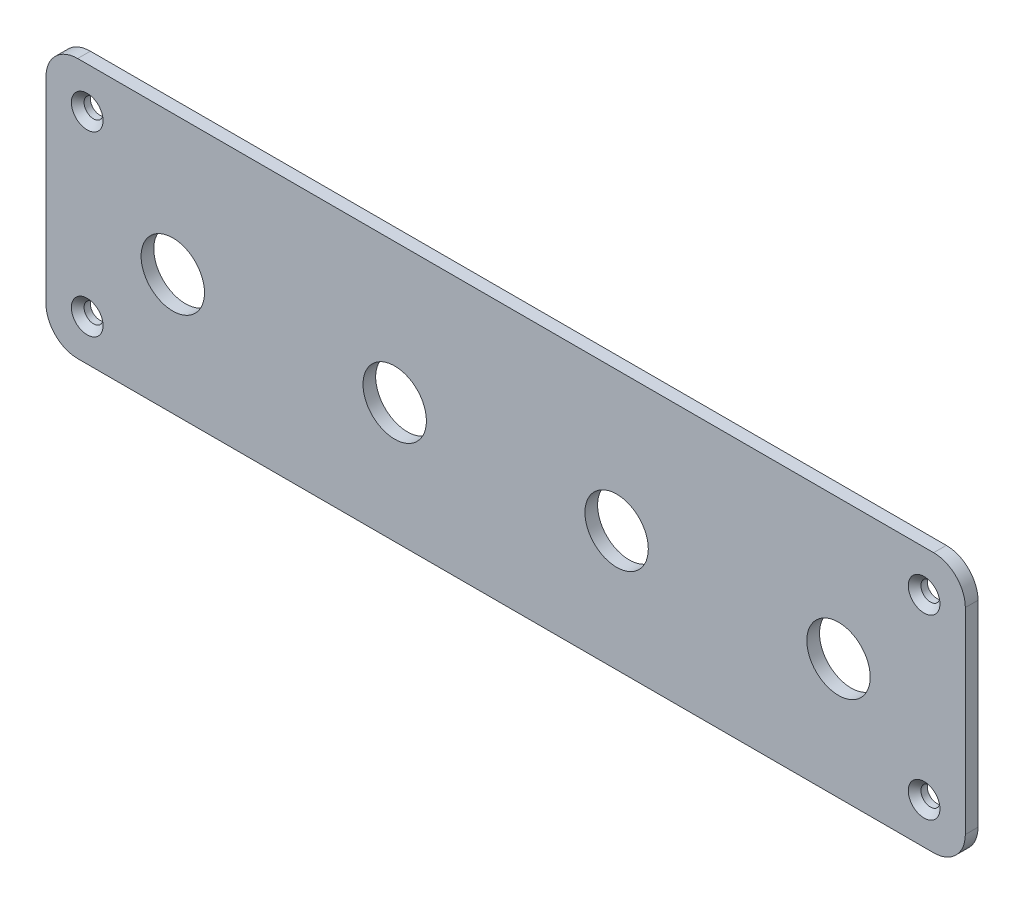
ISO-10303-21;
HEADER;
FILE_DESCRIPTION(('STEP AP214'),'2;1');
FILE_NAME('part.step','',(''),(''),'','','');
FILE_SCHEMA(('AUTOMOTIVE_DESIGN { 1 0 10303 214 1 1 1 1 }'));
ENDSEC;
DATA;
#1=APPLICATION_CONTEXT('core data for automotive mechanical design processes');
#2=APPLICATION_PROTOCOL_DEFINITION('international standard','automotive_design',2000,#1);
#3=PRODUCT_CONTEXT('',#1,'mechanical');
#4=PRODUCT('Part','Part','',(#3));
#5=PRODUCT_RELATED_PRODUCT_CATEGORY('part','',(#4));
#6=PRODUCT_DEFINITION_FORMATION('','',#4);
#7=PRODUCT_DEFINITION_CONTEXT('part definition',#1,'design');
#8=PRODUCT_DEFINITION('design','',#6,#7);
#9=PRODUCT_DEFINITION_SHAPE('','',#8);
#10=(LENGTH_UNIT() NAMED_UNIT(*) SI_UNIT(.MILLI.,.METRE.));
#11=(NAMED_UNIT(*) PLANE_ANGLE_UNIT() SI_UNIT($,.RADIAN.));
#12=(NAMED_UNIT(*) SI_UNIT($,.STERADIAN.) SOLID_ANGLE_UNIT());
#13=UNCERTAINTY_MEASURE_WITH_UNIT(LENGTH_MEASURE(1.E-05),#10,'distance_accuracy_value','');
#14=(GEOMETRIC_REPRESENTATION_CONTEXT(3) GLOBAL_UNCERTAINTY_ASSIGNED_CONTEXT((#13)) GLOBAL_UNIT_ASSIGNED_CONTEXT((#10,
#11,#12)) REPRESENTATION_CONTEXT('',''));
#15=CARTESIAN_POINT('',(0.,0.,0.));
#16=DIRECTION('',(0.,0.,1.));
#17=DIRECTION('',(1.,0.,0.));
#18=AXIS2_PLACEMENT_3D('',#15,#16,#17);
#19=CARTESIAN_POINT('',(67.5,15.5,-2.));
#20=DIRECTION('',(0.,0.,1.));
#21=DIRECTION('',(1.,0.,0.));
#22=AXIS2_PLACEMENT_3D('',#19,#20,#21);
#23=CYLINDRICAL_SURFACE('',#22,5.);
#24=CARTESIAN_POINT('',(67.5,15.5,0.));
#25=DIRECTION('',(0.,0.,1.));
#26=DIRECTION('',(-1.,0.,0.));
#27=AXIS2_PLACEMENT_3D('',#24,#25,#26);
#28=CIRCLE('',#27,5.);
#29=CARTESIAN_POINT('',(72.5000000000001,15.5,0.));
#30=VERTEX_POINT('',#29);
#31=CARTESIAN_POINT('',(67.5,20.5,0.));
#32=VERTEX_POINT('',#31);
#33=EDGE_CURVE('E148',#30,#32,#28,.T.);
#34=ORIENTED_EDGE('',*,*,#33,.F.);
#35=DIRECTION('',(0.,0.,1.));
#36=VECTOR('',#35,1.);
#37=CARTESIAN_POINT('',(72.5000000000001,15.5,-2.));
#38=LINE('',#37,#36);
#39=CARTESIAN_POINT('',(72.5000000000001,15.5,-2.));
#40=VERTEX_POINT('',#39);
#41=EDGE_CURVE('E60',#40,#30,#38,.T.);
#42=ORIENTED_EDGE('',*,*,#41,.F.);
#43=CARTESIAN_POINT('',(67.5,15.5,-2.));
#44=DIRECTION('',(0.,0.,1.));
#45=DIRECTION('',(-1.,0.,0.));
#46=AXIS2_PLACEMENT_3D('',#43,#44,#45);
#47=CIRCLE('',#46,5.);
#48=CARTESIAN_POINT('',(67.5,20.5,-2.));
#49=VERTEX_POINT('',#48);
#50=EDGE_CURVE('E178',#40,#49,#47,.T.);
#51=ORIENTED_EDGE('',*,*,#50,.T.);
#52=DIRECTION('',(0.,0.,1.));
#53=VECTOR('',#52,1.);
#54=CARTESIAN_POINT('',(67.5,20.5,-2.));
#55=LINE('',#54,#53);
#56=EDGE_CURVE('E101',#49,#32,#55,.T.);
#57=ORIENTED_EDGE('',*,*,#56,.T.);
#58=EDGE_LOOP('',(#34,#42,#51,#57));
#59=FACE_BOUND('',#58,.T.);
#60=ADVANCED_FACE('F41',(#59),#23,.T.);
#61=CARTESIAN_POINT('',(72.5000000000001,-15.5,-2.));
#62=DIRECTION('',(1.,0.,0.));
#63=DIRECTION('',(0.,0.,-1.));
#64=AXIS2_PLACEMENT_3D('',#61,#62,#63);
#65=PLANE('',#64);
#66=DIRECTION('',(0.,1.,0.));
#67=VECTOR('',#66,1.);
#68=CARTESIAN_POINT('',(72.5000000000001,-15.5,0.));
#69=LINE('',#68,#67);
#70=CARTESIAN_POINT('',(72.5000000000001,-15.5,0.));
#71=VERTEX_POINT('',#70);
#72=EDGE_CURVE('E174',#71,#30,#69,.T.);
#73=ORIENTED_EDGE('',*,*,#72,.F.);
#74=DIRECTION('',(0.,0.,1.));
#75=VECTOR('',#74,1.);
#76=CARTESIAN_POINT('',(72.5000000000001,-15.5,-2.));
#77=LINE('',#76,#75);
#78=CARTESIAN_POINT('',(72.5000000000001,-15.5,-2.));
#79=VERTEX_POINT('',#78);
#80=EDGE_CURVE('E89',#79,#71,#77,.T.);
#81=ORIENTED_EDGE('',*,*,#80,.F.);
#82=DIRECTION('',(0.,1.,0.));
#83=VECTOR('',#82,1.);
#84=CARTESIAN_POINT('',(72.5000000000001,-15.5,-2.));
#85=LINE('',#84,#83);
#86=EDGE_CURVE('E134',#79,#40,#85,.T.);
#87=ORIENTED_EDGE('',*,*,#86,.T.);
#88=ORIENTED_EDGE('',*,*,#41,.T.);
#89=EDGE_LOOP('',(#73,#81,#87,#88));
#90=FACE_BOUND('',#89,.T.);
#91=ADVANCED_FACE('F241',(#90),#65,.T.);
#92=CARTESIAN_POINT('',(67.5,-15.5,-2.));
#93=DIRECTION('',(0.,0.,1.));
#94=DIRECTION('',(1.,0.,0.));
#95=AXIS2_PLACEMENT_3D('',#92,#93,#94);
#96=CYLINDRICAL_SURFACE('',#95,5.);
#97=CARTESIAN_POINT('',(67.5,-15.5,0.));
#98=DIRECTION('',(0.,0.,1.));
#99=DIRECTION('',(-1.,0.,0.));
#100=AXIS2_PLACEMENT_3D('',#97,#98,#99);
#101=CIRCLE('',#100,5.);
#102=CARTESIAN_POINT('',(67.5,-20.5,0.));
#103=VERTEX_POINT('',#102);
#104=EDGE_CURVE('E120',#103,#71,#101,.T.);
#105=ORIENTED_EDGE('',*,*,#104,.F.);
#106=DIRECTION('',(0.,0.,1.));
#107=VECTOR('',#106,1.);
#108=CARTESIAN_POINT('',(67.5,-20.5,-2.));
#109=LINE('',#108,#107);
#110=CARTESIAN_POINT('',(67.5,-20.5,-2.));
#111=VERTEX_POINT('',#110);
#112=EDGE_CURVE('E115',#111,#103,#109,.T.);
#113=ORIENTED_EDGE('',*,*,#112,.F.);
#114=CARTESIAN_POINT('',(67.5,-15.5,-2.));
#115=DIRECTION('',(0.,0.,1.));
#116=DIRECTION('',(-1.,0.,0.));
#117=AXIS2_PLACEMENT_3D('',#114,#115,#116);
#118=CIRCLE('',#117,5.);
#119=EDGE_CURVE('E118',#111,#79,#118,.T.);
#120=ORIENTED_EDGE('',*,*,#119,.T.);
#121=ORIENTED_EDGE('',*,*,#80,.T.);
#122=EDGE_LOOP('',(#105,#113,#120,#121));
#123=FACE_BOUND('',#122,.T.);
#124=ADVANCED_FACE('F117',(#123),#96,.T.);
#125=CARTESIAN_POINT('',(-67.4999999999999,-20.5,-2.));
#126=DIRECTION('',(0.,-1.,0.));
#127=DIRECTION('',(0.,0.,-1.));
#128=AXIS2_PLACEMENT_3D('',#125,#126,#127);
#129=PLANE('',#128);
#130=DIRECTION('',(1.,0.,0.));
#131=VECTOR('',#130,1.);
#132=CARTESIAN_POINT('',(-67.4999999999999,-20.5,0.));
#133=LINE('',#132,#131);
#134=CARTESIAN_POINT('',(-67.4999999999999,-20.5,0.));
#135=VERTEX_POINT('',#134);
#136=EDGE_CURVE('E169',#135,#103,#133,.T.);
#137=ORIENTED_EDGE('',*,*,#136,.F.);
#138=DIRECTION('',(0.,0.,1.));
#139=VECTOR('',#138,1.);
#140=CARTESIAN_POINT('',(-67.4999999999999,-20.5,-2.));
#141=LINE('',#140,#139);
#142=CARTESIAN_POINT('',(-67.4999999999999,-20.5,-2.));
#143=VERTEX_POINT('',#142);
#144=EDGE_CURVE('E126',#143,#135,#141,.T.);
#145=ORIENTED_EDGE('',*,*,#144,.F.);
#146=DIRECTION('',(1.,0.,0.));
#147=VECTOR('',#146,1.);
#148=CARTESIAN_POINT('',(-67.4999999999999,-20.5,-2.));
#149=LINE('',#148,#147);
#150=EDGE_CURVE('E132',#143,#111,#149,.T.);
#151=ORIENTED_EDGE('',*,*,#150,.T.);
#152=ORIENTED_EDGE('',*,*,#112,.T.);
#153=EDGE_LOOP('',(#137,#145,#151,#152));
#154=FACE_BOUND('',#153,.T.);
#155=ADVANCED_FACE('F137',(#154),#129,.T.);
#156=CARTESIAN_POINT('',(-67.4999999999999,-15.5,-2.));
#157=DIRECTION('',(0.,0.,1.));
#158=DIRECTION('',(1.,0.,0.));
#159=AXIS2_PLACEMENT_3D('',#156,#157,#158);
#160=CYLINDRICAL_SURFACE('',#159,5.);
#161=CARTESIAN_POINT('',(-67.4999999999999,-15.5,0.));
#162=DIRECTION('',(0.,0.,1.));
#163=DIRECTION('',(-1.,0.,0.));
#164=AXIS2_PLACEMENT_3D('',#161,#162,#163);
#165=CIRCLE('',#164,5.);
#166=CARTESIAN_POINT('',(-72.4999999999999,-15.5,0.));
#167=VERTEX_POINT('',#166);
#168=EDGE_CURVE('E165',#167,#135,#165,.T.);
#169=ORIENTED_EDGE('',*,*,#168,.F.);
#170=DIRECTION('',(0.,0.,1.));
#171=VECTOR('',#170,1.);
#172=CARTESIAN_POINT('',(-72.4999999999999,-15.5,-2.));
#173=LINE('',#172,#171);
#174=CARTESIAN_POINT('',(-72.4999999999999,-15.5,-2.));
#175=VERTEX_POINT('',#174);
#176=EDGE_CURVE('E186',#175,#167,#173,.T.);
#177=ORIENTED_EDGE('',*,*,#176,.F.);
#178=CARTESIAN_POINT('',(-67.4999999999999,-15.5,-2.));
#179=DIRECTION('',(0.,0.,1.));
#180=DIRECTION('',(-1.,0.,0.));
#181=AXIS2_PLACEMENT_3D('',#178,#179,#180);
#182=CIRCLE('',#181,5.);
#183=EDGE_CURVE('E139',#175,#143,#182,.T.);
#184=ORIENTED_EDGE('',*,*,#183,.T.);
#185=ORIENTED_EDGE('',*,*,#144,.T.);
#186=EDGE_LOOP('',(#169,#177,#184,#185));
#187=FACE_BOUND('',#186,.T.);
#188=ADVANCED_FACE('F349',(#187),#160,.T.);
#189=CARTESIAN_POINT('',(-72.4999999999999,-15.5,-2.));
#190=DIRECTION('',(-1.,0.,0.));
#191=DIRECTION('',(0.,0.,1.));
#192=AXIS2_PLACEMENT_3D('',#189,#190,#191);
#193=PLANE('',#192);
#194=DIRECTION('',(0.,-1.,0.));
#195=VECTOR('',#194,1.);
#196=CARTESIAN_POINT('',(-72.4999999999999,-15.5,0.));
#197=LINE('',#196,#195);
#198=CARTESIAN_POINT('',(-72.4999999999999,15.5,0.));
#199=VERTEX_POINT('',#198);
#200=EDGE_CURVE('E161',#199,#167,#197,.T.);
#201=ORIENTED_EDGE('',*,*,#200,.F.);
#202=DIRECTION('',(0.,0.,1.));
#203=VECTOR('',#202,1.);
#204=CARTESIAN_POINT('',(-72.4999999999999,15.5,-2.));
#205=LINE('',#204,#203);
#206=CARTESIAN_POINT('',(-72.4999999999999,15.5,-2.));
#207=VERTEX_POINT('',#206);
#208=EDGE_CURVE('E189',#207,#199,#205,.T.);
#209=ORIENTED_EDGE('',*,*,#208,.F.);
#210=DIRECTION('',(0.,-1.,0.));
#211=VECTOR('',#210,1.);
#212=CARTESIAN_POINT('',(-72.4999999999999,-15.5,-2.));
#213=LINE('',#212,#211);
#214=EDGE_CURVE('E142',#207,#175,#213,.T.);
#215=ORIENTED_EDGE('',*,*,#214,.T.);
#216=ORIENTED_EDGE('',*,*,#176,.T.);
#217=EDGE_LOOP('',(#201,#209,#215,#216));
#218=FACE_BOUND('',#217,.T.);
#219=ADVANCED_FACE('F340',(#218),#193,.T.);
#220=CARTESIAN_POINT('',(-67.4999999999999,15.5,-2.));
#221=DIRECTION('',(0.,0.,1.));
#222=DIRECTION('',(1.,0.,0.));
#223=AXIS2_PLACEMENT_3D('',#220,#221,#222);
#224=CYLINDRICAL_SURFACE('',#223,5.);
#225=CARTESIAN_POINT('',(-67.4999999999999,15.5,0.));
#226=DIRECTION('',(0.,0.,1.));
#227=DIRECTION('',(-1.,0.,0.));
#228=AXIS2_PLACEMENT_3D('',#225,#226,#227);
#229=CIRCLE('',#228,5.);
#230=CARTESIAN_POINT('',(-67.4999999999999,20.5,0.));
#231=VERTEX_POINT('',#230);
#232=EDGE_CURVE('E157',#231,#199,#229,.T.);
#233=ORIENTED_EDGE('',*,*,#232,.F.);
#234=DIRECTION('',(0.,0.,1.));
#235=VECTOR('',#234,1.);
#236=CARTESIAN_POINT('',(-67.4999999999999,20.5,-2.));
#237=LINE('',#236,#235);
#238=CARTESIAN_POINT('',(-67.4999999999999,20.5,-2.));
#239=VERTEX_POINT('',#238);
#240=EDGE_CURVE('E192',#239,#231,#237,.T.);
#241=ORIENTED_EDGE('',*,*,#240,.F.);
#242=CARTESIAN_POINT('',(-67.4999999999999,15.5,-2.));
#243=DIRECTION('',(0.,0.,1.));
#244=DIRECTION('',(-1.,0.,0.));
#245=AXIS2_PLACEMENT_3D('',#242,#243,#244);
#246=CIRCLE('',#245,5.);
#247=EDGE_CURVE('E332',#239,#207,#246,.T.);
#248=ORIENTED_EDGE('',*,*,#247,.T.);
#249=ORIENTED_EDGE('',*,*,#208,.T.);
#250=EDGE_LOOP('',(#233,#241,#248,#249));
#251=FACE_BOUND('',#250,.T.);
#252=ADVANCED_FACE('F345',(#251),#224,.T.);
#253=CARTESIAN_POINT('',(-67.4999999999999,20.5,-2.));
#254=DIRECTION('',(0.,1.,0.));
#255=DIRECTION('',(0.,0.,1.));
#256=AXIS2_PLACEMENT_3D('',#253,#254,#255);
#257=PLANE('',#256);
#258=DIRECTION('',(-1.,0.,0.));
#259=VECTOR('',#258,1.);
#260=CARTESIAN_POINT('',(-67.4999999999999,20.5,0.));
#261=LINE('',#260,#259);
#262=EDGE_CURVE('E152',#32,#231,#261,.T.);
#263=ORIENTED_EDGE('',*,*,#262,.F.);
#264=ORIENTED_EDGE('',*,*,#56,.F.);
#265=DIRECTION('',(-1.,0.,0.));
#266=VECTOR('',#265,1.);
#267=CARTESIAN_POINT('',(-67.4999999999999,20.5,-2.));
#268=LINE('',#267,#266);
#269=EDGE_CURVE('E329',#49,#239,#268,.T.);
#270=ORIENTED_EDGE('',*,*,#269,.T.);
#271=ORIENTED_EDGE('',*,*,#240,.T.);
#272=EDGE_LOOP('',(#263,#264,#270,#271));
#273=FACE_BOUND('',#272,.T.);
#274=ADVANCED_FACE('F249',(#273),#257,.T.);
#275=CARTESIAN_POINT('',(67.5,15.5,-2.));
#276=DIRECTION('',(0.,0.,-1.));
#277=DIRECTION('',(-1.,0.,0.));
#278=AXIS2_PLACEMENT_3D('',#275,#276,#277);
#279=PLANE('',#278);
#280=CARTESIAN_POINT('',(66.0000000000001,14.,-2.));
#281=DIRECTION('',(0.,0.,1.));
#282=DIRECTION('',(1.,0.,0.));
#283=AXIS2_PLACEMENT_3D('',#280,#281,#282);
#284=CIRCLE('',#283,1.5);
#285=CARTESIAN_POINT('',(67.5000000000001,14.,-2.));
#286=VERTEX_POINT('',#285);
#287=EDGE_CURVE('E283',#286,#286,#284,.T.);
#288=ORIENTED_EDGE('',*,*,#287,.T.);
#289=EDGE_LOOP('',(#288));
#290=FACE_BOUND('',#289,.T.);
#291=CARTESIAN_POINT('',(66.0000000000001,-14.,-2.));
#292=DIRECTION('',(0.,0.,1.));
#293=DIRECTION('',(1.,0.,0.));
#294=AXIS2_PLACEMENT_3D('',#291,#292,#293);
#295=CIRCLE('',#294,1.49999999999998);
#296=CARTESIAN_POINT('',(67.5,-14.,-2.));
#297=VERTEX_POINT('',#296);
#298=EDGE_CURVE('E279',#297,#297,#295,.T.);
#299=ORIENTED_EDGE('',*,*,#298,.T.);
#300=EDGE_LOOP('',(#299));
#301=FACE_BOUND('',#300,.T.);
#302=CARTESIAN_POINT('',(-65.9999999999999,-14.,-2.));
#303=DIRECTION('',(0.,0.,1.));
#304=DIRECTION('',(1.,0.,0.));
#305=AXIS2_PLACEMENT_3D('',#302,#303,#304);
#306=CIRCLE('',#305,1.5);
#307=CARTESIAN_POINT('',(-64.4999999999999,-14.,-2.));
#308=VERTEX_POINT('',#307);
#309=EDGE_CURVE('E282',#308,#308,#306,.T.);
#310=ORIENTED_EDGE('',*,*,#309,.T.);
#311=EDGE_LOOP('',(#310));
#312=FACE_BOUND('',#311,.T.);
#313=CARTESIAN_POINT('',(-65.9999999999999,14.,-2.));
#314=DIRECTION('',(0.,0.,1.));
#315=DIRECTION('',(1.,0.,0.));
#316=AXIS2_PLACEMENT_3D('',#313,#314,#315);
#317=CIRCLE('',#316,1.5);
#318=CARTESIAN_POINT('',(-64.4999999999999,14.,-2.));
#319=VERTEX_POINT('',#318);
#320=EDGE_CURVE('E288',#319,#319,#317,.T.);
#321=ORIENTED_EDGE('',*,*,#320,.T.);
#322=EDGE_LOOP('',(#321));
#323=FACE_BOUND('',#322,.T.);
#324=CARTESIAN_POINT('',(52.5000000000001,-1.49999999999999,-2.));
#325=DIRECTION('',(0.,0.,1.));
#326=DIRECTION('',(1.,0.,0.));
#327=AXIS2_PLACEMENT_3D('',#324,#325,#326);
#328=CIRCLE('',#327,5.);
#329=CARTESIAN_POINT('',(57.5000000000001,-1.49999999999999,-2.));
#330=VERTEX_POINT('',#329);
#331=EDGE_CURVE('E297',#330,#330,#328,.T.);
#332=ORIENTED_EDGE('',*,*,#331,.T.);
#333=EDGE_LOOP('',(#332));
#334=FACE_BOUND('',#333,.T.);
#335=CARTESIAN_POINT('',(17.5000000000001,-1.49999999999999,-2.));
#336=DIRECTION('',(0.,0.,1.));
#337=DIRECTION('',(1.,0.,0.));
#338=AXIS2_PLACEMENT_3D('',#335,#336,#337);
#339=CIRCLE('',#338,5.);
#340=CARTESIAN_POINT('',(22.5000000000001,-1.49999999999999,-2.));
#341=VERTEX_POINT('',#340);
#342=EDGE_CURVE('E305',#341,#341,#339,.T.);
#343=ORIENTED_EDGE('',*,*,#342,.T.);
#344=EDGE_LOOP('',(#343));
#345=FACE_BOUND('',#344,.T.);
#346=CARTESIAN_POINT('',(-17.4999999999999,-1.49999999999999,-2.));
#347=DIRECTION('',(0.,0.,1.));
#348=DIRECTION('',(1.,0.,0.));
#349=AXIS2_PLACEMENT_3D('',#346,#347,#348);
#350=CIRCLE('',#349,5.);
#351=CARTESIAN_POINT('',(-12.4999999999999,-1.49999999999999,-2.));
#352=VERTEX_POINT('',#351);
#353=EDGE_CURVE('E313',#352,#352,#350,.T.);
#354=ORIENTED_EDGE('',*,*,#353,.T.);
#355=EDGE_LOOP('',(#354));
#356=FACE_BOUND('',#355,.T.);
#357=CARTESIAN_POINT('',(-52.5,-1.49999999999999,-2.));
#358=DIRECTION('',(0.,0.,1.));
#359=DIRECTION('',(1.,0.,0.));
#360=AXIS2_PLACEMENT_3D('',#357,#358,#359);
#361=CIRCLE('',#360,5.);
#362=CARTESIAN_POINT('',(-47.5,-1.49999999999999,-2.));
#363=VERTEX_POINT('',#362);
#364=EDGE_CURVE('E153',#363,#363,#361,.T.);
#365=ORIENTED_EDGE('',*,*,#364,.T.);
#366=EDGE_LOOP('',(#365));
#367=FACE_BOUND('',#366,.T.);
#368=ORIENTED_EDGE('',*,*,#50,.F.);
#369=ORIENTED_EDGE('',*,*,#86,.F.);
#370=ORIENTED_EDGE('',*,*,#119,.F.);
#371=ORIENTED_EDGE('',*,*,#150,.F.);
#372=ORIENTED_EDGE('',*,*,#183,.F.);
#373=ORIENTED_EDGE('',*,*,#214,.F.);
#374=ORIENTED_EDGE('',*,*,#247,.F.);
#375=ORIENTED_EDGE('',*,*,#269,.F.);
#376=EDGE_LOOP('',(#368,#369,#370,#371,#372,#373,#374,#375));
#377=FACE_BOUND('',#376,.T.);
#378=ADVANCED_FACE('F130',(#290,#301,#312,#323,#334,#345,#356,#367,#377),#279,.T.);
#379=CARTESIAN_POINT('',(67.5,15.5,0.));
#380=DIRECTION('',(0.,0.,-1.));
#381=DIRECTION('',(-1.,0.,0.));
#382=AXIS2_PLACEMENT_3D('',#379,#380,#381);
#383=PLANE('',#382);
#384=CARTESIAN_POINT('',(66.0000000000001,-14.,0.));
#385=DIRECTION('',(0.,0.,-1.));
#386=DIRECTION('',(-1.,0.,0.));
#387=AXIS2_PLACEMENT_3D('',#384,#385,#386);
#388=CIRCLE('',#387,2.50000000000002);
#389=CARTESIAN_POINT('',(63.5,-14.,0.));
#390=VERTEX_POINT('',#389);
#391=EDGE_CURVE('E212',#390,#390,#388,.T.);
#392=ORIENTED_EDGE('',*,*,#391,.T.);
#393=EDGE_LOOP('',(#392));
#394=FACE_BOUND('',#393,.T.);
#395=CARTESIAN_POINT('',(66.0000000000001,14.,0.));
#396=DIRECTION('',(0.,0.,-1.));
#397=DIRECTION('',(-1.,0.,0.));
#398=AXIS2_PLACEMENT_3D('',#395,#396,#397);
#399=CIRCLE('',#398,2.49999999999997);
#400=CARTESIAN_POINT('',(63.5000000000001,14.,0.));
#401=VERTEX_POINT('',#400);
#402=EDGE_CURVE('E208',#401,#401,#399,.T.);
#403=ORIENTED_EDGE('',*,*,#402,.T.);
#404=EDGE_LOOP('',(#403));
#405=FACE_BOUND('',#404,.T.);
#406=CARTESIAN_POINT('',(-65.9999999999999,-14.,0.));
#407=DIRECTION('',(0.,0.,-1.));
#408=DIRECTION('',(-1.,0.,0.));
#409=AXIS2_PLACEMENT_3D('',#406,#407,#408);
#410=CIRCLE('',#409,2.50000000000002);
#411=CARTESIAN_POINT('',(-68.5,-14.,0.));
#412=VERTEX_POINT('',#411);
#413=EDGE_CURVE('E204',#412,#412,#410,.T.);
#414=ORIENTED_EDGE('',*,*,#413,.T.);
#415=EDGE_LOOP('',(#414));
#416=FACE_BOUND('',#415,.T.);
#417=CARTESIAN_POINT('',(-65.9999999999999,14.,0.));
#418=DIRECTION('',(0.,0.,-1.));
#419=DIRECTION('',(-1.,0.,0.));
#420=AXIS2_PLACEMENT_3D('',#417,#418,#419);
#421=CIRCLE('',#420,2.50000000000002);
#422=CARTESIAN_POINT('',(-68.5,14.,0.));
#423=VERTEX_POINT('',#422);
#424=EDGE_CURVE('E200',#423,#423,#421,.T.);
#425=ORIENTED_EDGE('',*,*,#424,.T.);
#426=EDGE_LOOP('',(#425));
#427=FACE_BOUND('',#426,.T.);
#428=CARTESIAN_POINT('',(52.5000000000001,-1.49999999999999,0.));
#429=DIRECTION('',(0.,0.,1.));
#430=DIRECTION('',(1.,0.,0.));
#431=AXIS2_PLACEMENT_3D('',#428,#429,#430);
#432=CIRCLE('',#431,5.);
#433=CARTESIAN_POINT('',(57.5000000000001,-1.49999999999999,0.));
#434=VERTEX_POINT('',#433);
#435=EDGE_CURVE('E296',#434,#434,#432,.T.);
#436=ORIENTED_EDGE('',*,*,#435,.F.);
#437=EDGE_LOOP('',(#436));
#438=FACE_BOUND('',#437,.T.);
#439=CARTESIAN_POINT('',(17.5000000000001,-1.49999999999999,0.));
#440=DIRECTION('',(0.,0.,1.));
#441=DIRECTION('',(1.,0.,0.));
#442=AXIS2_PLACEMENT_3D('',#439,#440,#441);
#443=CIRCLE('',#442,5.);
#444=CARTESIAN_POINT('',(22.5000000000001,-1.49999999999999,0.));
#445=VERTEX_POINT('',#444);
#446=EDGE_CURVE('E301',#445,#445,#443,.T.);
#447=ORIENTED_EDGE('',*,*,#446,.F.);
#448=EDGE_LOOP('',(#447));
#449=FACE_BOUND('',#448,.T.);
#450=CARTESIAN_POINT('',(-17.4999999999999,-1.49999999999999,0.));
#451=DIRECTION('',(0.,0.,1.));
#452=DIRECTION('',(1.,0.,0.));
#453=AXIS2_PLACEMENT_3D('',#450,#451,#452);
#454=CIRCLE('',#453,5.);
#455=CARTESIAN_POINT('',(-12.4999999999999,-1.49999999999999,0.));
#456=VERTEX_POINT('',#455);
#457=EDGE_CURVE('E309',#456,#456,#454,.T.);
#458=ORIENTED_EDGE('',*,*,#457,.F.);
#459=EDGE_LOOP('',(#458));
#460=FACE_BOUND('',#459,.T.);
#461=CARTESIAN_POINT('',(-52.5,-1.49999999999999,0.));
#462=DIRECTION('',(0.,0.,1.));
#463=DIRECTION('',(1.,0.,0.));
#464=AXIS2_PLACEMENT_3D('',#461,#462,#463);
#465=CIRCLE('',#464,5.);
#466=CARTESIAN_POINT('',(-47.5,-1.49999999999999,0.));
#467=VERTEX_POINT('',#466);
#468=EDGE_CURVE('E317',#467,#467,#465,.T.);
#469=ORIENTED_EDGE('',*,*,#468,.F.);
#470=EDGE_LOOP('',(#469));
#471=FACE_BOUND('',#470,.T.);
#472=ORIENTED_EDGE('',*,*,#33,.T.);
#473=ORIENTED_EDGE('',*,*,#262,.T.);
#474=ORIENTED_EDGE('',*,*,#232,.T.);
#475=ORIENTED_EDGE('',*,*,#200,.T.);
#476=ORIENTED_EDGE('',*,*,#168,.T.);
#477=ORIENTED_EDGE('',*,*,#136,.T.);
#478=ORIENTED_EDGE('',*,*,#104,.T.);
#479=ORIENTED_EDGE('',*,*,#72,.T.);
#480=EDGE_LOOP('',(#472,#473,#474,#475,#476,#477,#478,#479));
#481=FACE_BOUND('',#480,.T.);
#482=ADVANCED_FACE('F347',(#394,#405,#416,#427,#438,#449,#460,#471,#481),#383,.F.);
#483=CARTESIAN_POINT('',(-52.5,-1.49999999999999,-2.));
#484=DIRECTION('',(0.,0.,1.));
#485=DIRECTION('',(1.,0.,0.));
#486=AXIS2_PLACEMENT_3D('',#483,#484,#485);
#487=CYLINDRICAL_SURFACE('',#486,5.);
#488=ORIENTED_EDGE('',*,*,#364,.F.);
#489=EDGE_LOOP('',(#488));
#490=FACE_BOUND('',#489,.T.);
#491=ORIENTED_EDGE('',*,*,#468,.T.);
#492=EDGE_LOOP('',(#491));
#493=FACE_BOUND('',#492,.T.);
#494=ADVANCED_FACE('F371',(#490,#493),#487,.F.);
#495=CARTESIAN_POINT('',(-17.4999999999999,-1.49999999999999,-2.));
#496=DIRECTION('',(0.,0.,1.));
#497=DIRECTION('',(1.,0.,0.));
#498=AXIS2_PLACEMENT_3D('',#495,#496,#497);
#499=CYLINDRICAL_SURFACE('',#498,5.);
#500=ORIENTED_EDGE('',*,*,#353,.F.);
#501=EDGE_LOOP('',(#500));
#502=FACE_BOUND('',#501,.T.);
#503=ORIENTED_EDGE('',*,*,#457,.T.);
#504=EDGE_LOOP('',(#503));
#505=FACE_BOUND('',#504,.T.);
#506=ADVANCED_FACE('F417',(#502,#505),#499,.F.);
#507=CARTESIAN_POINT('',(17.5000000000001,-1.49999999999999,-2.));
#508=DIRECTION('',(0.,0.,1.));
#509=DIRECTION('',(1.,0.,0.));
#510=AXIS2_PLACEMENT_3D('',#507,#508,#509);
#511=CYLINDRICAL_SURFACE('',#510,5.);
#512=ORIENTED_EDGE('',*,*,#342,.F.);
#513=EDGE_LOOP('',(#512));
#514=FACE_BOUND('',#513,.T.);
#515=ORIENTED_EDGE('',*,*,#446,.T.);
#516=EDGE_LOOP('',(#515));
#517=FACE_BOUND('',#516,.T.);
#518=ADVANCED_FACE('F426',(#514,#517),#511,.F.);
#519=CARTESIAN_POINT('',(52.5000000000001,-1.49999999999999,-2.));
#520=DIRECTION('',(0.,0.,1.));
#521=DIRECTION('',(1.,0.,0.));
#522=AXIS2_PLACEMENT_3D('',#519,#520,#521);
#523=CYLINDRICAL_SURFACE('',#522,5.);
#524=ORIENTED_EDGE('',*,*,#331,.F.);
#525=EDGE_LOOP('',(#524));
#526=FACE_BOUND('',#525,.T.);
#527=ORIENTED_EDGE('',*,*,#435,.T.);
#528=EDGE_LOOP('',(#527));
#529=FACE_BOUND('',#528,.T.);
#530=ADVANCED_FACE('F435',(#526,#529),#523,.F.);
#531=CARTESIAN_POINT('',(-65.9999999999999,14.,-2.));
#532=DIRECTION('',(0.,0.,1.));
#533=DIRECTION('',(1.,0.,0.));
#534=AXIS2_PLACEMENT_3D('',#531,#532,#533);
#535=CYLINDRICAL_SURFACE('',#534,1.5);
#536=CARTESIAN_POINT('',(-65.9999999999999,14.,-1.00000000000001));
#537=DIRECTION('',(0.,0.,-1.));
#538=DIRECTION('',(-1.,0.,0.));
#539=AXIS2_PLACEMENT_3D('',#536,#537,#538);
#540=CIRCLE('',#539,1.5);
#541=CARTESIAN_POINT('',(-67.4999999999999,14.,-1.00000000000001));
#542=VERTEX_POINT('',#541);
#543=EDGE_CURVE('E11',#542,#542,#540,.F.);
#544=ORIENTED_EDGE('',*,*,#543,.T.);
#545=EDGE_LOOP('',(#544));
#546=FACE_BOUND('',#545,.T.);
#547=ORIENTED_EDGE('',*,*,#320,.F.);
#548=EDGE_LOOP('',(#547));
#549=FACE_BOUND('',#548,.T.);
#550=ADVANCED_FACE('F445',(#546,#549),#535,.F.);
#551=CARTESIAN_POINT('',(-65.9999999999999,-14.,-2.));
#552=DIRECTION('',(0.,0.,1.));
#553=DIRECTION('',(1.,0.,0.));
#554=AXIS2_PLACEMENT_3D('',#551,#552,#553);
#555=CYLINDRICAL_SURFACE('',#554,1.5);
#556=CARTESIAN_POINT('',(-65.9999999999999,-14.,-1.00000000000001));
#557=DIRECTION('',(0.,0.,-1.));
#558=DIRECTION('',(-1.,0.,0.));
#559=AXIS2_PLACEMENT_3D('',#556,#557,#558);
#560=CIRCLE('',#559,1.5);
#561=CARTESIAN_POINT('',(-67.4999999999999,-14.,-1.00000000000001));
#562=VERTEX_POINT('',#561);
#563=EDGE_CURVE('E52',#562,#562,#560,.F.);
#564=ORIENTED_EDGE('',*,*,#563,.T.);
#565=EDGE_LOOP('',(#564));
#566=FACE_BOUND('',#565,.T.);
#567=ORIENTED_EDGE('',*,*,#309,.F.);
#568=EDGE_LOOP('',(#567));
#569=FACE_BOUND('',#568,.T.);
#570=ADVANCED_FACE('F223',(#566,#569),#555,.F.);
#571=CARTESIAN_POINT('',(66.0000000000001,-14.,-2.));
#572=DIRECTION('',(0.,0.,1.));
#573=DIRECTION('',(1.,0.,0.));
#574=AXIS2_PLACEMENT_3D('',#571,#572,#573);
#575=CYLINDRICAL_SURFACE('',#574,1.49999999999998);
#576=CARTESIAN_POINT('',(66.0000000000001,-14.,-1.00000000000004));
#577=DIRECTION('',(0.,0.,-1.));
#578=DIRECTION('',(-1.,0.,0.));
#579=AXIS2_PLACEMENT_3D('',#576,#577,#578);
#580=CIRCLE('',#579,1.49999999999998);
#581=CARTESIAN_POINT('',(64.5000000000001,-14.,-1.00000000000004));
#582=VERTEX_POINT('',#581);
#583=EDGE_CURVE('E181',#582,#582,#580,.F.);
#584=ORIENTED_EDGE('',*,*,#583,.T.);
#585=EDGE_LOOP('',(#584));
#586=FACE_BOUND('',#585,.T.);
#587=ORIENTED_EDGE('',*,*,#298,.F.);
#588=EDGE_LOOP('',(#587));
#589=FACE_BOUND('',#588,.T.);
#590=ADVANCED_FACE('F267',(#586,#589),#575,.F.);
#591=CARTESIAN_POINT('',(66.0000000000001,14.,-2.));
#592=DIRECTION('',(0.,0.,1.));
#593=DIRECTION('',(1.,0.,0.));
#594=AXIS2_PLACEMENT_3D('',#591,#592,#593);
#595=CYLINDRICAL_SURFACE('',#594,1.5);
#596=CARTESIAN_POINT('',(66.0000000000001,14.,-0.999999999999982));
#597=DIRECTION('',(0.,0.,-1.));
#598=DIRECTION('',(-1.,0.,0.));
#599=AXIS2_PLACEMENT_3D('',#596,#597,#598);
#600=CIRCLE('',#599,1.5);
#601=CARTESIAN_POINT('',(64.5000000000001,14.,-0.999999999999982));
#602=VERTEX_POINT('',#601);
#603=EDGE_CURVE('E216',#602,#602,#600,.F.);
#604=ORIENTED_EDGE('',*,*,#603,.T.);
#605=EDGE_LOOP('',(#604));
#606=FACE_BOUND('',#605,.T.);
#607=ORIENTED_EDGE('',*,*,#287,.F.);
#608=EDGE_LOOP('',(#607));
#609=FACE_BOUND('',#608,.T.);
#610=ADVANCED_FACE('F256',(#606,#609),#595,.F.);
#611=CARTESIAN_POINT('',(66.0000000000001,-14.,-1.00000000000004));
#612=DIRECTION('',(0.,0.,1.));
#613=DIRECTION('',(1.,0.,0.));
#614=AXIS2_PLACEMENT_3D('',#611,#612,#613);
#615=CONICAL_SURFACE('',#614,1.49999999999998,0.785398163397446);
#616=ORIENTED_EDGE('',*,*,#391,.F.);
#617=EDGE_LOOP('',(#616));
#618=FACE_BOUND('',#617,.T.);
#619=ORIENTED_EDGE('',*,*,#583,.F.);
#620=EDGE_LOOP('',(#619));
#621=FACE_BOUND('',#620,.T.);
#622=ADVANCED_FACE('F235',(#618,#621),#615,.F.);
#623=CARTESIAN_POINT('',(66.0000000000001,14.,-0.999999999999982));
#624=DIRECTION('',(0.,0.,1.));
#625=DIRECTION('',(1.,0.,0.));
#626=AXIS2_PLACEMENT_3D('',#623,#624,#625);
#627=CONICAL_SURFACE('',#626,1.5,0.785398163397446);
#628=ORIENTED_EDGE('',*,*,#402,.F.);
#629=EDGE_LOOP('',(#628));
#630=FACE_BOUND('',#629,.T.);
#631=ORIENTED_EDGE('',*,*,#603,.F.);
#632=EDGE_LOOP('',(#631));
#633=FACE_BOUND('',#632,.T.);
#634=ADVANCED_FACE('F228',(#630,#633),#627,.F.);
#635=CARTESIAN_POINT('',(-65.9999999999999,-14.,-1.00000000000001));
#636=DIRECTION('',(0.,0.,1.));
#637=DIRECTION('',(1.,0.,0.));
#638=AXIS2_PLACEMENT_3D('',#635,#636,#637);
#639=CONICAL_SURFACE('',#638,1.5,0.785398163397452);
#640=ORIENTED_EDGE('',*,*,#413,.F.);
#641=EDGE_LOOP('',(#640));
#642=FACE_BOUND('',#641,.T.);
#643=ORIENTED_EDGE('',*,*,#563,.F.);
#644=EDGE_LOOP('',(#643));
#645=FACE_BOUND('',#644,.T.);
#646=ADVANCED_FACE('F226',(#642,#645),#639,.F.);
#647=CARTESIAN_POINT('',(-65.9999999999999,14.,-1.00000000000001));
#648=DIRECTION('',(0.,0.,1.));
#649=DIRECTION('',(1.,0.,0.));
#650=AXIS2_PLACEMENT_3D('',#647,#648,#649);
#651=CONICAL_SURFACE('',#650,1.5,0.785398163397452);
#652=ORIENTED_EDGE('',*,*,#424,.F.);
#653=EDGE_LOOP('',(#652));
#654=FACE_BOUND('',#653,.T.);
#655=ORIENTED_EDGE('',*,*,#543,.F.);
#656=EDGE_LOOP('',(#655));
#657=FACE_BOUND('',#656,.T.);
#658=ADVANCED_FACE('F44',(#654,#657),#651,.F.);
#659=CLOSED_SHELL('',(#60,#91,#124,#155,#188,#219,#252,#274,#378,#482,#494,#506,#518,#530,#550,
#570,#590,#610,#622,#634,#646,#658));
#660=MANIFOLD_SOLID_BREP('B2',#659);
#661=ADVANCED_BREP_SHAPE_REPRESENTATION('',(#18,#660),#14);
#662=SHAPE_DEFINITION_REPRESENTATION(#9,#661);
ENDSEC;
END-ISO-10303-21;
